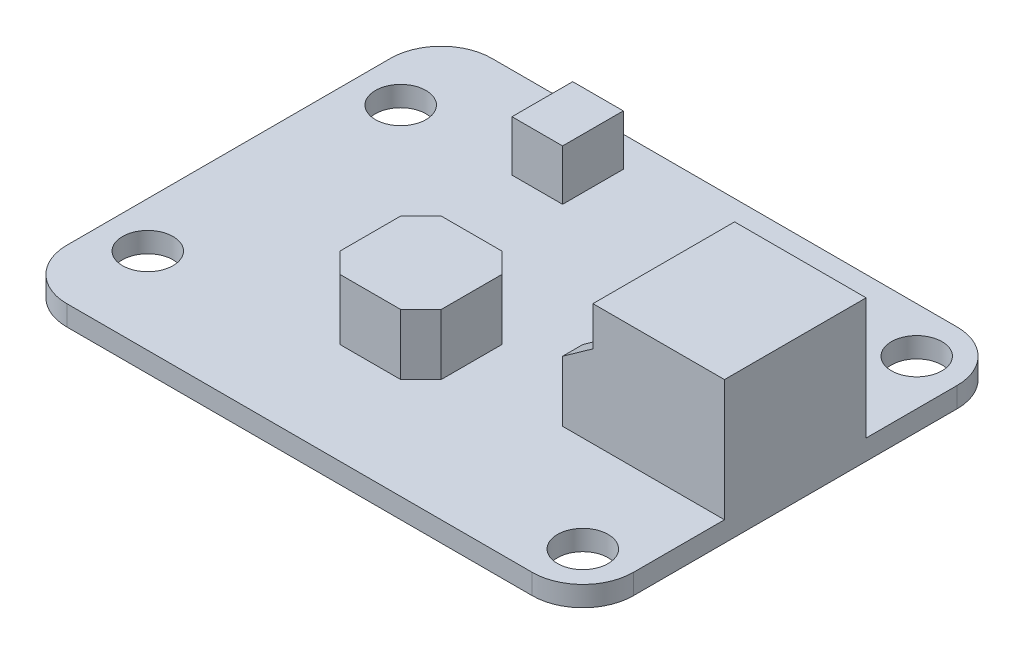
ISO-10303-21;
HEADER;
FILE_DESCRIPTION(('STEP AP214'),'2;1');
FILE_NAME('part.step','',(''),(''),'','','');
FILE_SCHEMA(('AUTOMOTIVE_DESIGN { 1 0 10303 214 1 1 1 1 }'));
ENDSEC;
DATA;
#1=APPLICATION_CONTEXT('core data for automotive mechanical design processes');
#2=APPLICATION_PROTOCOL_DEFINITION('international standard','automotive_design',2000,#1);
#3=PRODUCT_CONTEXT('',#1,'mechanical');
#4=PRODUCT('Part','Part','',(#3));
#5=PRODUCT_RELATED_PRODUCT_CATEGORY('part','',(#4));
#6=PRODUCT_DEFINITION_FORMATION('','',#4);
#7=PRODUCT_DEFINITION_CONTEXT('part definition',#1,'design');
#8=PRODUCT_DEFINITION('design','',#6,#7);
#9=PRODUCT_DEFINITION_SHAPE('','',#8);
#10=(LENGTH_UNIT() NAMED_UNIT(*) SI_UNIT(.MILLI.,.METRE.));
#11=(NAMED_UNIT(*) PLANE_ANGLE_UNIT() SI_UNIT($,.RADIAN.));
#12=(NAMED_UNIT(*) SI_UNIT($,.STERADIAN.) SOLID_ANGLE_UNIT());
#13=UNCERTAINTY_MEASURE_WITH_UNIT(LENGTH_MEASURE(1.E-05),#10,'distance_accuracy_value','');
#14=(GEOMETRIC_REPRESENTATION_CONTEXT(3) GLOBAL_UNCERTAINTY_ASSIGNED_CONTEXT((#13)) GLOBAL_UNIT_ASSIGNED_CONTEXT((#10,
#11,#12)) REPRESENTATION_CONTEXT('',''));
#15=CARTESIAN_POINT('',(0.,0.,0.));
#16=DIRECTION('',(0.,0.,1.));
#17=DIRECTION('',(1.,0.,0.));
#18=AXIS2_PLACEMENT_3D('',#15,#16,#17);
#19=CARTESIAN_POINT('',(11.5,1.,-8.));
#20=DIRECTION('',(0.,-1.,0.));
#21=DIRECTION('',(0.,0.,-1.));
#22=AXIS2_PLACEMENT_3D('',#19,#20,#21);
#23=PLANE('',#22);
#24=DIRECTION('',(-0.707106781186548,0.,0.707106781186548));
#25=VECTOR('',#24,1.);
#26=CARTESIAN_POINT('',(-4.,1.,1.5));
#27=LINE('',#26,#25);
#28=CARTESIAN_POINT('',(-3.,1.,0.5));
#29=VERTEX_POINT('',#28);
#30=CARTESIAN_POINT('',(-4.,1.,1.5));
#31=VERTEX_POINT('',#30);
#32=EDGE_CURVE('E250',#29,#31,#27,.T.);
#33=ORIENTED_EDGE('',*,*,#32,.F.);
#34=DIRECTION('',(-1.,0.,0.));
#35=VECTOR('',#34,1.);
#36=CARTESIAN_POINT('',(-3.,1.,0.5));
#37=LINE('',#36,#35);
#38=CARTESIAN_POINT('',(0.,1.,0.5));
#39=VERTEX_POINT('',#38);
#40=EDGE_CURVE('E263',#39,#29,#37,.T.);
#41=ORIENTED_EDGE('',*,*,#40,.F.);
#42=DIRECTION('',(-0.707106781186548,0.,-0.707106781186548));
#43=VECTOR('',#42,1.);
#44=CARTESIAN_POINT('',(1.,1.,1.5));
#45=LINE('',#44,#43);
#46=CARTESIAN_POINT('',(1.,1.,1.5));
#47=VERTEX_POINT('',#46);
#48=EDGE_CURVE('E292',#47,#39,#45,.T.);
#49=ORIENTED_EDGE('',*,*,#48,.F.);
#50=DIRECTION('',(0.,0.,-1.));
#51=VECTOR('',#50,1.);
#52=CARTESIAN_POINT('',(1.,1.,4.5));
#53=LINE('',#52,#51);
#54=CARTESIAN_POINT('',(1.,1.,4.5));
#55=VERTEX_POINT('',#54);
#56=EDGE_CURVE('E289',#55,#47,#53,.T.);
#57=ORIENTED_EDGE('',*,*,#56,.F.);
#58=DIRECTION('',(0.707106781186548,0.,-0.707106781186548));
#59=VECTOR('',#58,1.);
#60=CARTESIAN_POINT('',(0.,1.,5.5));
#61=LINE('',#60,#59);
#62=CARTESIAN_POINT('',(0.,1.,5.5));
#63=VERTEX_POINT('',#62);
#64=EDGE_CURVE('E286',#63,#55,#61,.T.);
#65=ORIENTED_EDGE('',*,*,#64,.F.);
#66=DIRECTION('',(1.,0.,0.));
#67=VECTOR('',#66,1.);
#68=CARTESIAN_POINT('',(-3.,1.,5.5));
#69=LINE('',#68,#67);
#70=CARTESIAN_POINT('',(-3.,1.,5.5));
#71=VERTEX_POINT('',#70);
#72=EDGE_CURVE('E283',#71,#63,#69,.T.);
#73=ORIENTED_EDGE('',*,*,#72,.F.);
#74=DIRECTION('',(0.707106781186548,0.,0.707106781186548));
#75=VECTOR('',#74,1.);
#76=CARTESIAN_POINT('',(-4.,1.,4.5));
#77=LINE('',#76,#75);
#78=CARTESIAN_POINT('',(-4.,1.,4.5));
#79=VERTEX_POINT('',#78);
#80=EDGE_CURVE('E280',#79,#71,#77,.T.);
#81=ORIENTED_EDGE('',*,*,#80,.F.);
#82=DIRECTION('',(0.,0.,1.));
#83=VECTOR('',#82,1.);
#84=CARTESIAN_POINT('',(-4.,1.,4.5));
#85=LINE('',#84,#83);
#86=EDGE_CURVE('E253',#31,#79,#85,.T.);
#87=ORIENTED_EDGE('',*,*,#86,.F.);
#88=EDGE_LOOP('',(#33,#41,#49,#57,#65,#73,#81,#87));
#89=FACE_BOUND('',#88,.T.);
#90=CARTESIAN_POINT('',(-11.75,1.,6.25));
#91=DIRECTION('',(0.,1.,0.));
#92=DIRECTION('',(0.,0.,1.));
#93=AXIS2_PLACEMENT_3D('',#90,#91,#92);
#94=CIRCLE('',#93,1.25);
#95=CARTESIAN_POINT('',(-11.75,1.,7.5));
#96=VERTEX_POINT('',#95);
#97=EDGE_CURVE('E390',#96,#96,#94,.T.);
#98=ORIENTED_EDGE('',*,*,#97,.F.);
#99=EDGE_LOOP('',(#98));
#100=FACE_BOUND('',#99,.T.);
#101=CARTESIAN_POINT('',(-11.75,1.,-6.25));
#102=DIRECTION('',(0.,1.,0.));
#103=DIRECTION('',(0.,0.,1.));
#104=AXIS2_PLACEMENT_3D('',#101,#102,#103);
#105=CIRCLE('',#104,1.25);
#106=CARTESIAN_POINT('',(-11.75,1.,-5.));
#107=VERTEX_POINT('',#106);
#108=EDGE_CURVE('E396',#107,#107,#105,.T.);
#109=ORIENTED_EDGE('',*,*,#108,.F.);
#110=EDGE_LOOP('',(#109));
#111=FACE_BOUND('',#110,.T.);
#112=CARTESIAN_POINT('',(11.75,1.,-8.25));
#113=DIRECTION('',(0.,1.,0.));
#114=DIRECTION('',(0.,0.,1.));
#115=AXIS2_PLACEMENT_3D('',#112,#113,#114);
#116=CIRCLE('',#115,1.25);
#117=CARTESIAN_POINT('',(11.75,1.,-7.));
#118=VERTEX_POINT('',#117);
#119=EDGE_CURVE('E402',#118,#118,#116,.T.);
#120=ORIENTED_EDGE('',*,*,#119,.F.);
#121=EDGE_LOOP('',(#120));
#122=FACE_BOUND('',#121,.T.);
#123=CARTESIAN_POINT('',(11.75,1.,8.25));
#124=DIRECTION('',(0.,1.,0.));
#125=DIRECTION('',(0.,0.,1.));
#126=AXIS2_PLACEMENT_3D('',#123,#124,#125);
#127=CIRCLE('',#126,1.25);
#128=CARTESIAN_POINT('',(11.75,1.,9.5));
#129=VERTEX_POINT('',#128);
#130=EDGE_CURVE('E408',#129,#129,#127,.T.);
#131=ORIENTED_EDGE('',*,*,#130,.F.);
#132=EDGE_LOOP('',(#131));
#133=FACE_BOUND('',#132,.T.);
#134=DIRECTION('',(-1.,0.,0.));
#135=VECTOR('',#134,1.);
#136=CARTESIAN_POINT('',(14.,1.,-3.5));
#137=LINE('',#136,#135);
#138=CARTESIAN_POINT('',(14.,1.,-3.5));
#139=VERTEX_POINT('',#138);
#140=CARTESIAN_POINT('',(6.,1.,-3.5));
#141=VERTEX_POINT('',#140);
#142=EDGE_CURVE('E345',#139,#141,#137,.T.);
#143=ORIENTED_EDGE('',*,*,#142,.F.);
#144=DIRECTION('',(0.,0.,-1.));
#145=VECTOR('',#144,1.);
#146=CARTESIAN_POINT('',(14.,1.,8.));
#147=LINE('',#146,#145);
#148=CARTESIAN_POINT('',(14.,1.,-8.));
#149=VERTEX_POINT('',#148);
#150=EDGE_CURVE('E430',#139,#149,#147,.T.);
#151=ORIENTED_EDGE('',*,*,#150,.T.);
#152=CARTESIAN_POINT('',(11.5,1.,-8.));
#153=DIRECTION('',(0.,1.,0.));
#154=DIRECTION('',(0.,0.,-1.));
#155=AXIS2_PLACEMENT_3D('',#152,#153,#154);
#156=CIRCLE('',#155,2.5);
#157=CARTESIAN_POINT('',(11.5,1.,-10.5));
#158=VERTEX_POINT('',#157);
#159=EDGE_CURVE('E414',#149,#158,#156,.T.);
#160=ORIENTED_EDGE('',*,*,#159,.T.);
#161=DIRECTION('',(-1.,0.,0.));
#162=VECTOR('',#161,1.);
#163=CARTESIAN_POINT('',(-11.5,1.,-10.5));
#164=LINE('',#163,#162);
#165=CARTESIAN_POINT('',(-11.5,1.,-10.5));
#166=VERTEX_POINT('',#165);
#167=EDGE_CURVE('E417',#158,#166,#164,.T.);
#168=ORIENTED_EDGE('',*,*,#167,.T.);
#169=CARTESIAN_POINT('',(-11.5,1.,-8.));
#170=DIRECTION('',(0.,1.,0.));
#171=DIRECTION('',(0.,0.,-1.));
#172=AXIS2_PLACEMENT_3D('',#169,#170,#171);
#173=CIRCLE('',#172,2.5);
#174=CARTESIAN_POINT('',(-14.,1.,-8.));
#175=VERTEX_POINT('',#174);
#176=EDGE_CURVE('E420',#166,#175,#173,.T.);
#177=ORIENTED_EDGE('',*,*,#176,.T.);
#178=DIRECTION('',(0.,0.,1.));
#179=VECTOR('',#178,1.);
#180=CARTESIAN_POINT('',(-14.,1.,8.));
#181=LINE('',#180,#179);
#182=CARTESIAN_POINT('',(-14.,1.,8.));
#183=VERTEX_POINT('',#182);
#184=EDGE_CURVE('E422',#175,#183,#181,.T.);
#185=ORIENTED_EDGE('',*,*,#184,.T.);
#186=CARTESIAN_POINT('',(-11.5,1.,8.));
#187=DIRECTION('',(0.,1.,0.));
#188=DIRECTION('',(0.,0.,-1.));
#189=AXIS2_PLACEMENT_3D('',#186,#187,#188);
#190=CIRCLE('',#189,2.5);
#191=CARTESIAN_POINT('',(-11.5,1.,10.5));
#192=VERTEX_POINT('',#191);
#193=EDGE_CURVE('E424',#183,#192,#190,.T.);
#194=ORIENTED_EDGE('',*,*,#193,.T.);
#195=DIRECTION('',(1.,0.,0.));
#196=VECTOR('',#195,1.);
#197=CARTESIAN_POINT('',(-11.5,1.,10.5));
#198=LINE('',#197,#196);
#199=CARTESIAN_POINT('',(11.5,1.,10.5));
#200=VERTEX_POINT('',#199);
#201=EDGE_CURVE('E426',#192,#200,#198,.T.);
#202=ORIENTED_EDGE('',*,*,#201,.T.);
#203=CARTESIAN_POINT('',(11.5,1.,8.));
#204=DIRECTION('',(0.,1.,0.));
#205=DIRECTION('',(0.,0.,1.));
#206=AXIS2_PLACEMENT_3D('',#203,#204,#205);
#207=CIRCLE('',#206,2.5);
#208=CARTESIAN_POINT('',(14.,1.,8.));
#209=VERTEX_POINT('',#208);
#210=EDGE_CURVE('E428',#200,#209,#207,.T.);
#211=ORIENTED_EDGE('',*,*,#210,.T.);
#212=CARTESIAN_POINT('',(14.,1.,3.5));
#213=VERTEX_POINT('',#212);
#214=EDGE_CURVE('E431',#209,#213,#147,.T.);
#215=ORIENTED_EDGE('',*,*,#214,.T.);
#216=DIRECTION('',(1.,0.,0.));
#217=VECTOR('',#216,1.);
#218=CARTESIAN_POINT('',(14.,1.,3.5));
#219=LINE('',#218,#217);
#220=CARTESIAN_POINT('',(6.,1.,3.5));
#221=VERTEX_POINT('',#220);
#222=EDGE_CURVE('E367',#221,#213,#219,.T.);
#223=ORIENTED_EDGE('',*,*,#222,.F.);
#224=DIRECTION('',(0.,0.,1.));
#225=VECTOR('',#224,1.);
#226=CARTESIAN_POINT('',(6.,1.,3.5));
#227=LINE('',#226,#225);
#228=CARTESIAN_POINT('',(6.,1.,2.5));
#229=VERTEX_POINT('',#228);
#230=EDGE_CURVE('E364',#229,#221,#227,.T.);
#231=ORIENTED_EDGE('',*,*,#230,.F.);
#232=DIRECTION('',(-1.,0.,0.));
#233=VECTOR('',#232,1.);
#234=CARTESIAN_POINT('',(7.5,1.,2.5));
#235=LINE('',#234,#233);
#236=CARTESIAN_POINT('',(7.5,1.,2.5));
#237=VERTEX_POINT('',#236);
#238=EDGE_CURVE('E361',#237,#229,#235,.T.);
#239=ORIENTED_EDGE('',*,*,#238,.F.);
#240=DIRECTION('',(0.,0.,1.));
#241=VECTOR('',#240,1.);
#242=CARTESIAN_POINT('',(7.5,1.,-2.5));
#243=LINE('',#242,#241);
#244=CARTESIAN_POINT('',(7.5,1.,-2.5));
#245=VERTEX_POINT('',#244);
#246=EDGE_CURVE('E358',#245,#237,#243,.T.);
#247=ORIENTED_EDGE('',*,*,#246,.F.);
#248=DIRECTION('',(1.,0.,0.));
#249=VECTOR('',#248,1.);
#250=CARTESIAN_POINT('',(6.,1.,-2.5));
#251=LINE('',#250,#249);
#252=CARTESIAN_POINT('',(6.,1.,-2.5));
#253=VERTEX_POINT('',#252);
#254=EDGE_CURVE('E355',#253,#245,#251,.T.);
#255=ORIENTED_EDGE('',*,*,#254,.F.);
#256=DIRECTION('',(0.,0.,1.));
#257=VECTOR('',#256,1.);
#258=CARTESIAN_POINT('',(6.,1.,-2.5));
#259=LINE('',#258,#257);
#260=EDGE_CURVE('E341',#141,#253,#259,.T.);
#261=ORIENTED_EDGE('',*,*,#260,.F.);
#262=EDGE_LOOP('',(#143,#151,#160,#168,#177,#185,#194,#202,#211,#215,#223,#231,#239,#247,#255,#261));
#263=FACE_BOUND('',#262,.T.);
#264=DIRECTION('',(0.,0.,-1.));
#265=VECTOR('',#264,1.);
#266=CARTESIAN_POINT('',(-3.5,1.,-9.));
#267=LINE('',#266,#265);
#268=CARTESIAN_POINT('',(-3.5,1.,-6.));
#269=VERTEX_POINT('',#268);
#270=CARTESIAN_POINT('',(-3.5,1.,-9.));
#271=VERTEX_POINT('',#270);
#272=EDGE_CURVE('E249',#269,#271,#267,.T.);
#273=ORIENTED_EDGE('',*,*,#272,.F.);
#274=DIRECTION('',(1.,0.,0.));
#275=VECTOR('',#274,1.);
#276=CARTESIAN_POINT('',(-6.,1.,-6.));
#277=LINE('',#276,#275);
#278=CARTESIAN_POINT('',(-6.,1.,-6.));
#279=VERTEX_POINT('',#278);
#280=EDGE_CURVE('E246',#279,#269,#277,.T.);
#281=ORIENTED_EDGE('',*,*,#280,.F.);
#282=DIRECTION('',(0.,0.,1.));
#283=VECTOR('',#282,1.);
#284=CARTESIAN_POINT('',(-6.,1.,-9.));
#285=LINE('',#284,#283);
#286=CARTESIAN_POINT('',(-6.,1.,-9.));
#287=VERTEX_POINT('',#286);
#288=EDGE_CURVE('E52',#287,#279,#285,.T.);
#289=ORIENTED_EDGE('',*,*,#288,.F.);
#290=DIRECTION('',(-1.,0.,0.));
#291=VECTOR('',#290,1.);
#292=CARTESIAN_POINT('',(-6.,1.,-9.));
#293=LINE('',#292,#291);
#294=EDGE_CURVE('E47',#271,#287,#293,.T.);
#295=ORIENTED_EDGE('',*,*,#294,.F.);
#296=EDGE_LOOP('',(#273,#281,#289,#295));
#297=FACE_BOUND('',#296,.T.);
#298=ADVANCED_FACE('F32',(#89,#100,#111,#122,#133,#263,#297),#23,.F.);
#299=CARTESIAN_POINT('',(11.5,0.,-8.));
#300=DIRECTION('',(0.,-1.,0.));
#301=DIRECTION('',(0.,0.,-1.));
#302=AXIS2_PLACEMENT_3D('',#299,#300,#301);
#303=PLANE('',#302);
#304=CARTESIAN_POINT('',(-11.75,0.,-6.25));
#305=DIRECTION('',(0.,1.,0.));
#306=DIRECTION('',(0.,0.,1.));
#307=AXIS2_PLACEMENT_3D('',#304,#305,#306);
#308=CIRCLE('',#307,1.25);
#309=CARTESIAN_POINT('',(-11.75,0.,-5.));
#310=VERTEX_POINT('',#309);
#311=EDGE_CURVE('E393',#310,#310,#308,.T.);
#312=ORIENTED_EDGE('',*,*,#311,.T.);
#313=EDGE_LOOP('',(#312));
#314=FACE_BOUND('',#313,.T.);
#315=CARTESIAN_POINT('',(11.75,0.,8.25));
#316=DIRECTION('',(0.,1.,0.));
#317=DIRECTION('',(0.,0.,1.));
#318=AXIS2_PLACEMENT_3D('',#315,#316,#317);
#319=CIRCLE('',#318,1.25);
#320=CARTESIAN_POINT('',(11.75,0.,9.5));
#321=VERTEX_POINT('',#320);
#322=EDGE_CURVE('E405',#321,#321,#319,.T.);
#323=ORIENTED_EDGE('',*,*,#322,.T.);
#324=EDGE_LOOP('',(#323));
#325=FACE_BOUND('',#324,.T.);
#326=CARTESIAN_POINT('',(11.5,0.,-8.));
#327=DIRECTION('',(0.,1.,0.));
#328=DIRECTION('',(0.,0.,-1.));
#329=AXIS2_PLACEMENT_3D('',#326,#327,#328);
#330=CIRCLE('',#329,2.5);
#331=CARTESIAN_POINT('',(14.,0.,-8.));
#332=VERTEX_POINT('',#331);
#333=CARTESIAN_POINT('',(11.5,0.,-10.5));
#334=VERTEX_POINT('',#333);
#335=EDGE_CURVE('E411',#332,#334,#330,.T.);
#336=ORIENTED_EDGE('',*,*,#335,.F.);
#337=DIRECTION('',(0.,0.,-1.));
#338=VECTOR('',#337,1.);
#339=CARTESIAN_POINT('',(14.,0.,8.));
#340=LINE('',#339,#338);
#341=CARTESIAN_POINT('',(14.,0.,8.));
#342=VERTEX_POINT('',#341);
#343=EDGE_CURVE('E418',#342,#332,#340,.T.);
#344=ORIENTED_EDGE('',*,*,#343,.F.);
#345=CARTESIAN_POINT('',(11.5,0.,8.));
#346=DIRECTION('',(0.,1.,0.));
#347=DIRECTION('',(0.,0.,1.));
#348=AXIS2_PLACEMENT_3D('',#345,#346,#347);
#349=CIRCLE('',#348,2.5);
#350=CARTESIAN_POINT('',(11.5,0.,10.5));
#351=VERTEX_POINT('',#350);
#352=EDGE_CURVE('E446',#351,#342,#349,.T.);
#353=ORIENTED_EDGE('',*,*,#352,.F.);
#354=DIRECTION('',(1.,0.,0.));
#355=VECTOR('',#354,1.);
#356=CARTESIAN_POINT('',(-11.5,0.,10.5));
#357=LINE('',#356,#355);
#358=CARTESIAN_POINT('',(-11.5,0.,10.5));
#359=VERTEX_POINT('',#358);
#360=EDGE_CURVE('E444',#359,#351,#357,.T.);
#361=ORIENTED_EDGE('',*,*,#360,.F.);
#362=CARTESIAN_POINT('',(-11.5,0.,8.));
#363=DIRECTION('',(0.,1.,0.));
#364=DIRECTION('',(0.,0.,-1.));
#365=AXIS2_PLACEMENT_3D('',#362,#363,#364);
#366=CIRCLE('',#365,2.5);
#367=CARTESIAN_POINT('',(-14.,0.,8.));
#368=VERTEX_POINT('',#367);
#369=EDGE_CURVE('E442',#368,#359,#366,.T.);
#370=ORIENTED_EDGE('',*,*,#369,.F.);
#371=DIRECTION('',(0.,0.,1.));
#372=VECTOR('',#371,1.);
#373=CARTESIAN_POINT('',(-14.,0.,8.));
#374=LINE('',#373,#372);
#375=CARTESIAN_POINT('',(-14.,0.,-8.));
#376=VERTEX_POINT('',#375);
#377=EDGE_CURVE('E440',#376,#368,#374,.T.);
#378=ORIENTED_EDGE('',*,*,#377,.F.);
#379=CARTESIAN_POINT('',(-11.5,0.,-8.));
#380=DIRECTION('',(0.,1.,0.));
#381=DIRECTION('',(0.,0.,-1.));
#382=AXIS2_PLACEMENT_3D('',#379,#380,#381);
#383=CIRCLE('',#382,2.5);
#384=CARTESIAN_POINT('',(-11.5,0.,-10.5));
#385=VERTEX_POINT('',#384);
#386=EDGE_CURVE('E438',#385,#376,#383,.T.);
#387=ORIENTED_EDGE('',*,*,#386,.F.);
#388=DIRECTION('',(-1.,0.,0.));
#389=VECTOR('',#388,1.);
#390=CARTESIAN_POINT('',(-11.5,0.,-10.5));
#391=LINE('',#390,#389);
#392=EDGE_CURVE('E436',#334,#385,#391,.T.);
#393=ORIENTED_EDGE('',*,*,#392,.F.);
#394=EDGE_LOOP('',(#336,#344,#353,#361,#370,#378,#387,#393));
#395=FACE_BOUND('',#394,.T.);
#396=CARTESIAN_POINT('',(11.75,0.,-8.25));
#397=DIRECTION('',(0.,1.,0.));
#398=DIRECTION('',(0.,0.,1.));
#399=AXIS2_PLACEMENT_3D('',#396,#397,#398);
#400=CIRCLE('',#399,1.25);
#401=CARTESIAN_POINT('',(11.75,0.,-7.));
#402=VERTEX_POINT('',#401);
#403=EDGE_CURVE('E399',#402,#402,#400,.T.);
#404=ORIENTED_EDGE('',*,*,#403,.T.);
#405=EDGE_LOOP('',(#404));
#406=FACE_BOUND('',#405,.T.);
#407=CARTESIAN_POINT('',(-11.75,0.,6.25));
#408=DIRECTION('',(0.,1.,0.));
#409=DIRECTION('',(0.,0.,1.));
#410=AXIS2_PLACEMENT_3D('',#407,#408,#409);
#411=CIRCLE('',#410,1.25);
#412=CARTESIAN_POINT('',(-11.75,0.,7.5));
#413=VERTEX_POINT('',#412);
#414=EDGE_CURVE('E389',#413,#413,#411,.T.);
#415=ORIENTED_EDGE('',*,*,#414,.T.);
#416=EDGE_LOOP('',(#415));
#417=FACE_BOUND('',#416,.T.);
#418=ADVANCED_FACE('F479',(#314,#325,#395,#406,#417),#303,.T.);
#419=CARTESIAN_POINT('',(11.5,1.,-8.));
#420=DIRECTION('',(0.,-1.,0.));
#421=DIRECTION('',(0.,0.,-1.));
#422=AXIS2_PLACEMENT_3D('',#419,#420,#421);
#423=CYLINDRICAL_SURFACE('',#422,2.5);
#424=ORIENTED_EDGE('',*,*,#335,.T.);
#425=DIRECTION('',(0.,-1.,0.));
#426=VECTOR('',#425,1.);
#427=CARTESIAN_POINT('',(11.5,1.,-10.5));
#428=LINE('',#427,#426);
#429=EDGE_CURVE('E40',#158,#334,#428,.T.);
#430=ORIENTED_EDGE('',*,*,#429,.F.);
#431=ORIENTED_EDGE('',*,*,#159,.F.);
#432=DIRECTION('',(0.,-1.,0.));
#433=VECTOR('',#432,1.);
#434=CARTESIAN_POINT('',(14.,1.,-8.));
#435=LINE('',#434,#433);
#436=EDGE_CURVE('E433',#149,#332,#435,.T.);
#437=ORIENTED_EDGE('',*,*,#436,.T.);
#438=EDGE_LOOP('',(#424,#430,#431,#437));
#439=FACE_BOUND('',#438,.T.);
#440=ADVANCED_FACE('F34',(#439),#423,.T.);
#441=CARTESIAN_POINT('',(-11.5,1.,-10.5));
#442=DIRECTION('',(0.,0.,1.));
#443=DIRECTION('',(1.,0.,0.));
#444=AXIS2_PLACEMENT_3D('',#441,#442,#443);
#445=PLANE('',#444);
#446=ORIENTED_EDGE('',*,*,#392,.T.);
#447=DIRECTION('',(0.,-1.,0.));
#448=VECTOR('',#447,1.);
#449=CARTESIAN_POINT('',(-11.5,1.,-10.5));
#450=LINE('',#449,#448);
#451=EDGE_CURVE('E466',#166,#385,#450,.T.);
#452=ORIENTED_EDGE('',*,*,#451,.F.);
#453=ORIENTED_EDGE('',*,*,#167,.F.);
#454=ORIENTED_EDGE('',*,*,#429,.T.);
#455=EDGE_LOOP('',(#446,#452,#453,#454));
#456=FACE_BOUND('',#455,.T.);
#457=ADVANCED_FACE('F471',(#456),#445,.F.);
#458=CARTESIAN_POINT('',(-11.5,1.,-8.));
#459=DIRECTION('',(0.,-1.,0.));
#460=DIRECTION('',(0.,0.,-1.));
#461=AXIS2_PLACEMENT_3D('',#458,#459,#460);
#462=CYLINDRICAL_SURFACE('',#461,2.5);
#463=ORIENTED_EDGE('',*,*,#386,.T.);
#464=DIRECTION('',(0.,-1.,0.));
#465=VECTOR('',#464,1.);
#466=CARTESIAN_POINT('',(-14.,1.,-8.));
#467=LINE('',#466,#465);
#468=EDGE_CURVE('E463',#175,#376,#467,.T.);
#469=ORIENTED_EDGE('',*,*,#468,.F.);
#470=ORIENTED_EDGE('',*,*,#176,.F.);
#471=ORIENTED_EDGE('',*,*,#451,.T.);
#472=EDGE_LOOP('',(#463,#469,#470,#471));
#473=FACE_BOUND('',#472,.T.);
#474=ADVANCED_FACE('F487',(#473),#462,.T.);
#475=CARTESIAN_POINT('',(-14.,1.,8.));
#476=DIRECTION('',(1.,0.,0.));
#477=DIRECTION('',(0.,0.,-1.));
#478=AXIS2_PLACEMENT_3D('',#475,#476,#477);
#479=PLANE('',#478);
#480=ORIENTED_EDGE('',*,*,#377,.T.);
#481=DIRECTION('',(0.,-1.,0.));
#482=VECTOR('',#481,1.);
#483=CARTESIAN_POINT('',(-14.,1.,8.));
#484=LINE('',#483,#482);
#485=EDGE_CURVE('E460',#183,#368,#484,.T.);
#486=ORIENTED_EDGE('',*,*,#485,.F.);
#487=ORIENTED_EDGE('',*,*,#184,.F.);
#488=ORIENTED_EDGE('',*,*,#468,.T.);
#489=EDGE_LOOP('',(#480,#486,#487,#488));
#490=FACE_BOUND('',#489,.T.);
#491=ADVANCED_FACE('F491',(#490),#479,.F.);
#492=CARTESIAN_POINT('',(-11.5,1.,8.));
#493=DIRECTION('',(0.,-1.,0.));
#494=DIRECTION('',(0.,0.,-1.));
#495=AXIS2_PLACEMENT_3D('',#492,#493,#494);
#496=CYLINDRICAL_SURFACE('',#495,2.5);
#497=ORIENTED_EDGE('',*,*,#369,.T.);
#498=DIRECTION('',(0.,-1.,0.));
#499=VECTOR('',#498,1.);
#500=CARTESIAN_POINT('',(-11.5,1.,10.5));
#501=LINE('',#500,#499);
#502=EDGE_CURVE('E457',#192,#359,#501,.T.);
#503=ORIENTED_EDGE('',*,*,#502,.F.);
#504=ORIENTED_EDGE('',*,*,#193,.F.);
#505=ORIENTED_EDGE('',*,*,#485,.T.);
#506=EDGE_LOOP('',(#497,#503,#504,#505));
#507=FACE_BOUND('',#506,.T.);
#508=ADVANCED_FACE('F512',(#507),#496,.T.);
#509=CARTESIAN_POINT('',(-11.5,1.,10.5));
#510=DIRECTION('',(0.,0.,-1.));
#511=DIRECTION('',(-1.,0.,0.));
#512=AXIS2_PLACEMENT_3D('',#509,#510,#511);
#513=PLANE('',#512);
#514=ORIENTED_EDGE('',*,*,#360,.T.);
#515=DIRECTION('',(0.,-1.,0.));
#516=VECTOR('',#515,1.);
#517=CARTESIAN_POINT('',(11.5,1.,10.5));
#518=LINE('',#517,#516);
#519=EDGE_CURVE('E454',#200,#351,#518,.T.);
#520=ORIENTED_EDGE('',*,*,#519,.F.);
#521=ORIENTED_EDGE('',*,*,#201,.F.);
#522=ORIENTED_EDGE('',*,*,#502,.T.);
#523=EDGE_LOOP('',(#514,#520,#521,#522));
#524=FACE_BOUND('',#523,.T.);
#525=ADVANCED_FACE('F509',(#524),#513,.F.);
#526=CARTESIAN_POINT('',(11.5,1.,8.));
#527=DIRECTION('',(0.,-1.,0.));
#528=DIRECTION('',(0.,0.,-1.));
#529=AXIS2_PLACEMENT_3D('',#526,#527,#528);
#530=CYLINDRICAL_SURFACE('',#529,2.5);
#531=ORIENTED_EDGE('',*,*,#352,.T.);
#532=DIRECTION('',(0.,-1.,0.));
#533=VECTOR('',#532,1.);
#534=CARTESIAN_POINT('',(14.,1.,8.));
#535=LINE('',#534,#533);
#536=EDGE_CURVE('E451',#209,#342,#535,.T.);
#537=ORIENTED_EDGE('',*,*,#536,.F.);
#538=ORIENTED_EDGE('',*,*,#210,.F.);
#539=ORIENTED_EDGE('',*,*,#519,.T.);
#540=EDGE_LOOP('',(#531,#537,#538,#539));
#541=FACE_BOUND('',#540,.T.);
#542=ADVANCED_FACE('F505',(#541),#530,.T.);
#543=CARTESIAN_POINT('',(14.,1.,8.));
#544=DIRECTION('',(-1.,0.,0.));
#545=DIRECTION('',(0.,0.,1.));
#546=AXIS2_PLACEMENT_3D('',#543,#544,#545);
#547=PLANE('',#546);
#548=ORIENTED_EDGE('',*,*,#343,.T.);
#549=ORIENTED_EDGE('',*,*,#436,.F.);
#550=ORIENTED_EDGE('',*,*,#150,.F.);
#551=DIRECTION('',(0.,-1.,0.));
#552=VECTOR('',#551,1.);
#553=CARTESIAN_POINT('',(14.,7.,-3.5));
#554=LINE('',#553,#552);
#555=CARTESIAN_POINT('',(14.,7.,-3.5));
#556=VERTEX_POINT('',#555);
#557=EDGE_CURVE('E373',#556,#139,#554,.T.);
#558=ORIENTED_EDGE('',*,*,#557,.F.);
#559=DIRECTION('',(0.,0.,-1.));
#560=VECTOR('',#559,1.);
#561=CARTESIAN_POINT('',(14.,7.,3.5));
#562=LINE('',#561,#560);
#563=CARTESIAN_POINT('',(14.,7.,3.5));
#564=VERTEX_POINT('',#563);
#565=EDGE_CURVE('E347',#564,#556,#562,.T.);
#566=ORIENTED_EDGE('',*,*,#565,.F.);
#567=DIRECTION('',(0.,-1.,0.));
#568=VECTOR('',#567,1.);
#569=CARTESIAN_POINT('',(14.,7.,3.5));
#570=LINE('',#569,#568);
#571=EDGE_CURVE('E376',#564,#213,#570,.T.);
#572=ORIENTED_EDGE('',*,*,#571,.T.);
#573=ORIENTED_EDGE('',*,*,#214,.F.);
#574=ORIENTED_EDGE('',*,*,#536,.T.);
#575=EDGE_LOOP('',(#548,#549,#550,#558,#566,#572,#573,#574));
#576=FACE_BOUND('',#575,.T.);
#577=ADVANCED_FACE('F500',(#576),#547,.F.);
#578=CARTESIAN_POINT('',(11.75,1.,8.25));
#579=DIRECTION('',(0.,-1.,0.));
#580=DIRECTION('',(0.,0.,-1.));
#581=AXIS2_PLACEMENT_3D('',#578,#579,#580);
#582=CYLINDRICAL_SURFACE('',#581,1.25);
#583=ORIENTED_EDGE('',*,*,#130,.T.);
#584=EDGE_LOOP('',(#583));
#585=FACE_BOUND('',#584,.T.);
#586=ORIENTED_EDGE('',*,*,#322,.F.);
#587=EDGE_LOOP('',(#586));
#588=FACE_BOUND('',#587,.T.);
#589=ADVANCED_FACE('F531',(#585,#588),#582,.F.);
#590=CARTESIAN_POINT('',(11.75,1.,-8.25));
#591=DIRECTION('',(0.,-1.,0.));
#592=DIRECTION('',(0.,0.,-1.));
#593=AXIS2_PLACEMENT_3D('',#590,#591,#592);
#594=CYLINDRICAL_SURFACE('',#593,1.25);
#595=ORIENTED_EDGE('',*,*,#119,.T.);
#596=EDGE_LOOP('',(#595));
#597=FACE_BOUND('',#596,.T.);
#598=ORIENTED_EDGE('',*,*,#403,.F.);
#599=EDGE_LOOP('',(#598));
#600=FACE_BOUND('',#599,.T.);
#601=ADVANCED_FACE('F553',(#597,#600),#594,.F.);
#602=CARTESIAN_POINT('',(-11.75,1.,-6.25));
#603=DIRECTION('',(0.,-1.,0.));
#604=DIRECTION('',(0.,0.,-1.));
#605=AXIS2_PLACEMENT_3D('',#602,#603,#604);
#606=CYLINDRICAL_SURFACE('',#605,1.25);
#607=ORIENTED_EDGE('',*,*,#108,.T.);
#608=EDGE_LOOP('',(#607));
#609=FACE_BOUND('',#608,.T.);
#610=ORIENTED_EDGE('',*,*,#311,.F.);
#611=EDGE_LOOP('',(#610));
#612=FACE_BOUND('',#611,.T.);
#613=ADVANCED_FACE('F560',(#609,#612),#606,.F.);
#614=CARTESIAN_POINT('',(-11.75,1.,6.25));
#615=DIRECTION('',(0.,-1.,0.));
#616=DIRECTION('',(0.,0.,-1.));
#617=AXIS2_PLACEMENT_3D('',#614,#615,#616);
#618=CYLINDRICAL_SURFACE('',#617,1.25);
#619=ORIENTED_EDGE('',*,*,#97,.T.);
#620=EDGE_LOOP('',(#619));
#621=FACE_BOUND('',#620,.T.);
#622=ORIENTED_EDGE('',*,*,#414,.F.);
#623=EDGE_LOOP('',(#622));
#624=FACE_BOUND('',#623,.T.);
#625=ADVANCED_FACE('F567',(#621,#624),#618,.F.);
#626=CARTESIAN_POINT('',(6.,7.,-2.5));
#627=DIRECTION('',(1.,0.,0.));
#628=DIRECTION('',(0.,0.,-1.));
#629=AXIS2_PLACEMENT_3D('',#626,#627,#628);
#630=PLANE('',#629);
#631=DIRECTION('',(0.,-1.,0.));
#632=VECTOR('',#631,1.);
#633=CARTESIAN_POINT('',(6.,7.,-2.5));
#634=LINE('',#633,#632);
#635=CARTESIAN_POINT('',(6.,4.,-2.5));
#636=VERTEX_POINT('',#635);
#637=EDGE_CURVE('E387',#636,#253,#634,.T.);
#638=ORIENTED_EDGE('',*,*,#637,.F.);
#639=DIRECTION('',(0.,0.,1.));
#640=VECTOR('',#639,1.);
#641=CARTESIAN_POINT('',(6.,4.,-10.5));
#642=LINE('',#641,#640);
#643=CARTESIAN_POINT('',(6.,4.,-3.5));
#644=VERTEX_POINT('',#643);
#645=EDGE_CURVE('E330',#644,#636,#642,.T.);
#646=ORIENTED_EDGE('',*,*,#645,.F.);
#647=DIRECTION('',(0.,-1.,0.));
#648=VECTOR('',#647,1.);
#649=CARTESIAN_POINT('',(6.,7.,-3.5));
#650=LINE('',#649,#648);
#651=EDGE_CURVE('E352',#644,#141,#650,.T.);
#652=ORIENTED_EDGE('',*,*,#651,.T.);
#653=ORIENTED_EDGE('',*,*,#260,.T.);
#654=EDGE_LOOP('',(#638,#646,#652,#653));
#655=FACE_BOUND('',#654,.T.);
#656=ADVANCED_FACE('F574',(#655),#630,.F.);
#657=CARTESIAN_POINT('',(6.,7.,-2.5));
#658=DIRECTION('',(0.,0.,-1.));
#659=DIRECTION('',(-1.,0.,0.));
#660=AXIS2_PLACEMENT_3D('',#657,#658,#659);
#661=PLANE('',#660);
#662=DIRECTION('',(0.,-1.,0.));
#663=VECTOR('',#662,1.);
#664=CARTESIAN_POINT('',(7.5,7.,-2.5));
#665=LINE('',#664,#663);
#666=CARTESIAN_POINT('',(7.5,5.06401717505367,-2.5));
#667=VERTEX_POINT('',#666);
#668=EDGE_CURVE('E385',#667,#245,#665,.T.);
#669=ORIENTED_EDGE('',*,*,#668,.F.);
#670=DIRECTION('',(-0.815635175400038,-0.57856655680237,0.));
#671=VECTOR('',#670,1.);
#672=CARTESIAN_POINT('',(7.41569770511429,5.00421778195045,-2.5));
#673=LINE('',#672,#671);
#674=EDGE_CURVE('E338',#667,#636,#673,.T.);
#675=ORIENTED_EDGE('',*,*,#674,.T.);
#676=ORIENTED_EDGE('',*,*,#637,.T.);
#677=ORIENTED_EDGE('',*,*,#254,.T.);
#678=EDGE_LOOP('',(#669,#675,#676,#677));
#679=FACE_BOUND('',#678,.T.);
#680=ADVANCED_FACE('F581',(#679),#661,.F.);
#681=CARTESIAN_POINT('',(7.5,7.,-2.5));
#682=DIRECTION('',(1.,0.,0.));
#683=DIRECTION('',(0.,0.,-1.));
#684=AXIS2_PLACEMENT_3D('',#681,#682,#683);
#685=PLANE('',#684);
#686=DIRECTION('',(0.,-1.,0.));
#687=VECTOR('',#686,1.);
#688=CARTESIAN_POINT('',(7.5,7.,2.5));
#689=LINE('',#688,#687);
#690=CARTESIAN_POINT('',(7.5,5.06401717505367,2.5));
#691=VERTEX_POINT('',#690);
#692=EDGE_CURVE('E383',#691,#237,#689,.T.);
#693=ORIENTED_EDGE('',*,*,#692,.F.);
#694=DIRECTION('',(0.,0.,1.));
#695=VECTOR('',#694,1.);
#696=CARTESIAN_POINT('',(7.5,5.06401717505367,-10.5));
#697=LINE('',#696,#695);
#698=CARTESIAN_POINT('',(7.5,5.06401717505367,3.5));
#699=VERTEX_POINT('',#698);
#700=EDGE_CURVE('E327',#691,#699,#697,.T.);
#701=ORIENTED_EDGE('',*,*,#700,.T.);
#702=DIRECTION('',(0.,1.,0.));
#703=VECTOR('',#702,1.);
#704=CARTESIAN_POINT('',(7.5,7.,3.5));
#705=LINE('',#704,#703);
#706=CARTESIAN_POINT('',(7.5,7.,3.5));
#707=VERTEX_POINT('',#706);
#708=EDGE_CURVE('E323',#699,#707,#705,.T.);
#709=ORIENTED_EDGE('',*,*,#708,.T.);
#710=DIRECTION('',(0.,0.,1.));
#711=VECTOR('',#710,1.);
#712=CARTESIAN_POINT('',(7.5,7.,-2.5));
#713=LINE('',#712,#711);
#714=CARTESIAN_POINT('',(7.5,7.,-3.5));
#715=VERTEX_POINT('',#714);
#716=EDGE_CURVE('E342',#715,#707,#713,.T.);
#717=ORIENTED_EDGE('',*,*,#716,.F.);
#718=DIRECTION('',(0.,1.,0.));
#719=VECTOR('',#718,1.);
#720=CARTESIAN_POINT('',(7.5,7.,-3.5));
#721=LINE('',#720,#719);
#722=CARTESIAN_POINT('',(7.5,5.06401717505367,-3.5));
#723=VERTEX_POINT('',#722);
#724=EDGE_CURVE('E332',#723,#715,#721,.T.);
#725=ORIENTED_EDGE('',*,*,#724,.F.);
#726=EDGE_CURVE('E329',#723,#667,#697,.T.);
#727=ORIENTED_EDGE('',*,*,#726,.T.);
#728=ORIENTED_EDGE('',*,*,#668,.T.);
#729=ORIENTED_EDGE('',*,*,#246,.T.);
#730=EDGE_LOOP('',(#693,#701,#709,#717,#725,#727,#728,#729));
#731=FACE_BOUND('',#730,.T.);
#732=ADVANCED_FACE('F589',(#731),#685,.F.);
#733=CARTESIAN_POINT('',(7.5,7.,2.5));
#734=DIRECTION('',(0.,0.,1.));
#735=DIRECTION('',(1.,0.,0.));
#736=AXIS2_PLACEMENT_3D('',#733,#734,#735);
#737=PLANE('',#736);
#738=DIRECTION('',(0.,-1.,0.));
#739=VECTOR('',#738,1.);
#740=CARTESIAN_POINT('',(6.,7.,2.5));
#741=LINE('',#740,#739);
#742=CARTESIAN_POINT('',(6.,4.,2.5));
#743=VERTEX_POINT('',#742);
#744=EDGE_CURVE('E381',#743,#229,#741,.T.);
#745=ORIENTED_EDGE('',*,*,#744,.F.);
#746=DIRECTION('',(0.815635175400038,0.57856655680237,0.));
#747=VECTOR('',#746,1.);
#748=CARTESIAN_POINT('',(8.41358881413907,5.71206663450759,2.5));
#749=LINE('',#748,#747);
#750=EDGE_CURVE('E335',#743,#691,#749,.T.);
#751=ORIENTED_EDGE('',*,*,#750,.T.);
#752=ORIENTED_EDGE('',*,*,#692,.T.);
#753=ORIENTED_EDGE('',*,*,#238,.T.);
#754=EDGE_LOOP('',(#745,#751,#752,#753));
#755=FACE_BOUND('',#754,.T.);
#756=ADVANCED_FACE('F597',(#755),#737,.F.);
#757=CARTESIAN_POINT('',(6.,7.,3.5));
#758=DIRECTION('',(1.,0.,0.));
#759=DIRECTION('',(0.,0.,-1.));
#760=AXIS2_PLACEMENT_3D('',#757,#758,#759);
#761=PLANE('',#760);
#762=DIRECTION('',(0.,-1.,0.));
#763=VECTOR('',#762,1.);
#764=CARTESIAN_POINT('',(6.,7.,3.5));
#765=LINE('',#764,#763);
#766=CARTESIAN_POINT('',(6.,4.,3.5));
#767=VERTEX_POINT('',#766);
#768=EDGE_CURVE('E379',#767,#221,#765,.T.);
#769=ORIENTED_EDGE('',*,*,#768,.F.);
#770=EDGE_CURVE('E326',#743,#767,#642,.T.);
#771=ORIENTED_EDGE('',*,*,#770,.F.);
#772=ORIENTED_EDGE('',*,*,#744,.T.);
#773=ORIENTED_EDGE('',*,*,#230,.T.);
#774=EDGE_LOOP('',(#769,#771,#772,#773));
#775=FACE_BOUND('',#774,.T.);
#776=ADVANCED_FACE('F605',(#775),#761,.F.);
#777=CARTESIAN_POINT('',(14.,7.,3.5));
#778=DIRECTION('',(0.,0.,-1.));
#779=DIRECTION('',(-1.,0.,0.));
#780=AXIS2_PLACEMENT_3D('',#777,#778,#779);
#781=PLANE('',#780);
#782=DIRECTION('',(1.,0.,0.));
#783=VECTOR('',#782,1.);
#784=CARTESIAN_POINT('',(14.,7.,3.5));
#785=LINE('',#784,#783);
#786=EDGE_CURVE('E344',#707,#564,#785,.T.);
#787=ORIENTED_EDGE('',*,*,#786,.F.);
#788=ORIENTED_EDGE('',*,*,#708,.F.);
#789=DIRECTION('',(0.815635175400037,0.57856655680237,0.));
#790=VECTOR('',#789,1.);
#791=CARTESIAN_POINT('',(7.5,5.06401717505367,3.5));
#792=LINE('',#791,#790);
#793=EDGE_CURVE('E320',#767,#699,#792,.T.);
#794=ORIENTED_EDGE('',*,*,#793,.F.);
#795=ORIENTED_EDGE('',*,*,#768,.T.);
#796=ORIENTED_EDGE('',*,*,#222,.T.);
#797=ORIENTED_EDGE('',*,*,#571,.F.);
#798=EDGE_LOOP('',(#787,#788,#794,#795,#796,#797));
#799=FACE_BOUND('',#798,.T.);
#800=ADVANCED_FACE('F613',(#799),#781,.F.);
#801=CARTESIAN_POINT('',(14.,7.,-3.5));
#802=DIRECTION('',(0.,0.,1.));
#803=DIRECTION('',(1.,0.,0.));
#804=AXIS2_PLACEMENT_3D('',#801,#802,#803);
#805=PLANE('',#804);
#806=DIRECTION('',(0.815635175400038,0.57856655680237,0.));
#807=VECTOR('',#806,1.);
#808=CARTESIAN_POINT('',(12.7377836199131,8.77941166225523,-3.5));
#809=LINE('',#808,#807);
#810=EDGE_CURVE('E11',#644,#723,#809,.T.);
#811=ORIENTED_EDGE('',*,*,#810,.T.);
#812=ORIENTED_EDGE('',*,*,#724,.T.);
#813=DIRECTION('',(-1.,0.,0.));
#814=VECTOR('',#813,1.);
#815=CARTESIAN_POINT('',(14.,7.,-3.5));
#816=LINE('',#815,#814);
#817=EDGE_CURVE('E349',#556,#715,#816,.T.);
#818=ORIENTED_EDGE('',*,*,#817,.F.);
#819=ORIENTED_EDGE('',*,*,#557,.T.);
#820=ORIENTED_EDGE('',*,*,#142,.T.);
#821=ORIENTED_EDGE('',*,*,#651,.F.);
#822=EDGE_LOOP('',(#811,#812,#818,#819,#820,#821));
#823=FACE_BOUND('',#822,.T.);
#824=ADVANCED_FACE('F621',(#823),#805,.F.);
#825=CARTESIAN_POINT('',(0.,7.,0.));
#826=DIRECTION('',(0.,1.,0.));
#827=DIRECTION('',(0.,0.,1.));
#828=AXIS2_PLACEMENT_3D('',#825,#826,#827);
#829=PLANE('',#828);
#830=ORIENTED_EDGE('',*,*,#716,.T.);
#831=ORIENTED_EDGE('',*,*,#786,.T.);
#832=ORIENTED_EDGE('',*,*,#565,.T.);
#833=ORIENTED_EDGE('',*,*,#817,.T.);
#834=EDGE_LOOP('',(#830,#831,#832,#833));
#835=FACE_BOUND('',#834,.T.);
#836=ADVANCED_FACE('F629',(#835),#829,.T.);
#837=CARTESIAN_POINT('',(7.5,5.06401717505367,-10.5));
#838=DIRECTION('',(0.57856655680237,-0.815635175400037,0.));
#839=DIRECTION('',(0.815635175400038,0.57856655680237,0.));
#840=AXIS2_PLACEMENT_3D('',#837,#838,#839);
#841=PLANE('',#840);
#842=ORIENTED_EDGE('',*,*,#726,.F.);
#843=ORIENTED_EDGE('',*,*,#810,.F.);
#844=ORIENTED_EDGE('',*,*,#645,.T.);
#845=ORIENTED_EDGE('',*,*,#674,.F.);
#846=EDGE_LOOP('',(#842,#843,#844,#845));
#847=FACE_BOUND('',#846,.T.);
#848=ADVANCED_FACE('F637',(#847),#841,.F.);
#849=ORIENTED_EDGE('',*,*,#770,.T.);
#850=ORIENTED_EDGE('',*,*,#793,.T.);
#851=ORIENTED_EDGE('',*,*,#700,.F.);
#852=ORIENTED_EDGE('',*,*,#750,.F.);
#853=EDGE_LOOP('',(#849,#850,#851,#852));
#854=FACE_BOUND('',#853,.T.);
#855=ADVANCED_FACE('F645',(#854),#841,.F.);
#856=CARTESIAN_POINT('',(-4.,4.,1.5));
#857=DIRECTION('',(0.707106781186547,0.,0.707106781186547));
#858=DIRECTION('',(0.707106781186548,0.,-0.707106781186548));
#859=AXIS2_PLACEMENT_3D('',#856,#857,#858);
#860=PLANE('',#859);
#861=ORIENTED_EDGE('',*,*,#32,.T.);
#862=DIRECTION('',(0.,-1.,0.));
#863=VECTOR('',#862,1.);
#864=CARTESIAN_POINT('',(-4.,4.,1.5));
#865=LINE('',#864,#863);
#866=CARTESIAN_POINT('',(-4.,4.,1.5));
#867=VERTEX_POINT('',#866);
#868=EDGE_CURVE('E317',#867,#31,#865,.T.);
#869=ORIENTED_EDGE('',*,*,#868,.F.);
#870=DIRECTION('',(-0.707106781186548,0.,0.707106781186548));
#871=VECTOR('',#870,1.);
#872=CARTESIAN_POINT('',(-4.,4.,1.5));
#873=LINE('',#872,#871);
#874=CARTESIAN_POINT('',(-3.,4.,0.5));
#875=VERTEX_POINT('',#874);
#876=EDGE_CURVE('E259',#875,#867,#873,.T.);
#877=ORIENTED_EDGE('',*,*,#876,.F.);
#878=DIRECTION('',(0.,-1.,0.));
#879=VECTOR('',#878,1.);
#880=CARTESIAN_POINT('',(-3.,4.,0.5));
#881=LINE('',#880,#879);
#882=EDGE_CURVE('E276',#875,#29,#881,.T.);
#883=ORIENTED_EDGE('',*,*,#882,.T.);
#884=EDGE_LOOP('',(#861,#869,#877,#883));
#885=FACE_BOUND('',#884,.T.);
#886=ADVANCED_FACE('F653',(#885),#860,.F.);
#887=CARTESIAN_POINT('',(-4.,4.,4.5));
#888=DIRECTION('',(1.,0.,0.));
#889=DIRECTION('',(0.,0.,-1.));
#890=AXIS2_PLACEMENT_3D('',#887,#888,#889);
#891=PLANE('',#890);
#892=ORIENTED_EDGE('',*,*,#86,.T.);
#893=DIRECTION('',(0.,-1.,0.));
#894=VECTOR('',#893,1.);
#895=CARTESIAN_POINT('',(-4.,4.,4.5));
#896=LINE('',#895,#894);
#897=CARTESIAN_POINT('',(-4.,4.,4.5));
#898=VERTEX_POINT('',#897);
#899=EDGE_CURVE('E314',#898,#79,#896,.T.);
#900=ORIENTED_EDGE('',*,*,#899,.F.);
#901=DIRECTION('',(0.,0.,1.));
#902=VECTOR('',#901,1.);
#903=CARTESIAN_POINT('',(-4.,4.,4.5));
#904=LINE('',#903,#902);
#905=EDGE_CURVE('E262',#867,#898,#904,.T.);
#906=ORIENTED_EDGE('',*,*,#905,.F.);
#907=ORIENTED_EDGE('',*,*,#868,.T.);
#908=EDGE_LOOP('',(#892,#900,#906,#907));
#909=FACE_BOUND('',#908,.T.);
#910=ADVANCED_FACE('F660',(#909),#891,.F.);
#911=CARTESIAN_POINT('',(-4.,4.,4.5));
#912=DIRECTION('',(0.707106781186547,0.,-0.707106781186547));
#913=DIRECTION('',(-0.707106781186548,0.,-0.707106781186548));
#914=AXIS2_PLACEMENT_3D('',#911,#912,#913);
#915=PLANE('',#914);
#916=ORIENTED_EDGE('',*,*,#80,.T.);
#917=DIRECTION('',(0.,-1.,0.));
#918=VECTOR('',#917,1.);
#919=CARTESIAN_POINT('',(-3.,4.,5.5));
#920=LINE('',#919,#918);
#921=CARTESIAN_POINT('',(-3.,4.,5.5));
#922=VERTEX_POINT('',#921);
#923=EDGE_CURVE('E311',#922,#71,#920,.T.);
#924=ORIENTED_EDGE('',*,*,#923,.F.);
#925=DIRECTION('',(0.707106781186548,0.,0.707106781186548));
#926=VECTOR('',#925,1.);
#927=CARTESIAN_POINT('',(-4.,4.,4.5));
#928=LINE('',#927,#926);
#929=EDGE_CURVE('E265',#898,#922,#928,.T.);
#930=ORIENTED_EDGE('',*,*,#929,.F.);
#931=ORIENTED_EDGE('',*,*,#899,.T.);
#932=EDGE_LOOP('',(#916,#924,#930,#931));
#933=FACE_BOUND('',#932,.T.);
#934=ADVANCED_FACE('F668',(#933),#915,.F.);
#935=CARTESIAN_POINT('',(-3.,4.,5.5));
#936=DIRECTION('',(0.,0.,-1.));
#937=DIRECTION('',(-1.,0.,0.));
#938=AXIS2_PLACEMENT_3D('',#935,#936,#937);
#939=PLANE('',#938);
#940=ORIENTED_EDGE('',*,*,#72,.T.);
#941=DIRECTION('',(0.,-1.,0.));
#942=VECTOR('',#941,1.);
#943=CARTESIAN_POINT('',(0.,4.,5.5));
#944=LINE('',#943,#942);
#945=CARTESIAN_POINT('',(0.,4.,5.5));
#946=VERTEX_POINT('',#945);
#947=EDGE_CURVE('E308',#946,#63,#944,.T.);
#948=ORIENTED_EDGE('',*,*,#947,.F.);
#949=DIRECTION('',(1.,0.,0.));
#950=VECTOR('',#949,1.);
#951=CARTESIAN_POINT('',(-3.,4.,5.5));
#952=LINE('',#951,#950);
#953=EDGE_CURVE('E267',#922,#946,#952,.T.);
#954=ORIENTED_EDGE('',*,*,#953,.F.);
#955=ORIENTED_EDGE('',*,*,#923,.T.);
#956=EDGE_LOOP('',(#940,#948,#954,#955));
#957=FACE_BOUND('',#956,.T.);
#958=ADVANCED_FACE('F676',(#957),#939,.F.);
#959=CARTESIAN_POINT('',(0.,4.,5.5));
#960=DIRECTION('',(-0.707106781186547,0.,-0.707106781186547));
#961=DIRECTION('',(-0.707106781186548,0.,0.707106781186548));
#962=AXIS2_PLACEMENT_3D('',#959,#960,#961);
#963=PLANE('',#962);
#964=ORIENTED_EDGE('',*,*,#64,.T.);
#965=DIRECTION('',(0.,-1.,0.));
#966=VECTOR('',#965,1.);
#967=CARTESIAN_POINT('',(1.,4.,4.5));
#968=LINE('',#967,#966);
#969=CARTESIAN_POINT('',(1.,4.,4.5));
#970=VERTEX_POINT('',#969);
#971=EDGE_CURVE('E305',#970,#55,#968,.T.);
#972=ORIENTED_EDGE('',*,*,#971,.F.);
#973=DIRECTION('',(0.707106781186548,0.,-0.707106781186548));
#974=VECTOR('',#973,1.);
#975=CARTESIAN_POINT('',(0.,4.,5.5));
#976=LINE('',#975,#974);
#977=EDGE_CURVE('E269',#946,#970,#976,.T.);
#978=ORIENTED_EDGE('',*,*,#977,.F.);
#979=ORIENTED_EDGE('',*,*,#947,.T.);
#980=EDGE_LOOP('',(#964,#972,#978,#979));
#981=FACE_BOUND('',#980,.T.);
#982=ADVANCED_FACE('F684',(#981),#963,.F.);
#983=CARTESIAN_POINT('',(1.,4.,4.5));
#984=DIRECTION('',(-1.,0.,0.));
#985=DIRECTION('',(0.,0.,1.));
#986=AXIS2_PLACEMENT_3D('',#983,#984,#985);
#987=PLANE('',#986);
#988=ORIENTED_EDGE('',*,*,#56,.T.);
#989=DIRECTION('',(0.,-1.,0.));
#990=VECTOR('',#989,1.);
#991=CARTESIAN_POINT('',(1.,4.,1.5));
#992=LINE('',#991,#990);
#993=CARTESIAN_POINT('',(1.,4.,1.5));
#994=VERTEX_POINT('',#993);
#995=EDGE_CURVE('E302',#994,#47,#992,.T.);
#996=ORIENTED_EDGE('',*,*,#995,.F.);
#997=DIRECTION('',(0.,0.,-1.));
#998=VECTOR('',#997,1.);
#999=CARTESIAN_POINT('',(1.,4.,4.5));
#1000=LINE('',#999,#998);
#1001=EDGE_CURVE('E271',#970,#994,#1000,.T.);
#1002=ORIENTED_EDGE('',*,*,#1001,.F.);
#1003=ORIENTED_EDGE('',*,*,#971,.T.);
#1004=EDGE_LOOP('',(#988,#996,#1002,#1003));
#1005=FACE_BOUND('',#1004,.T.);
#1006=ADVANCED_FACE('F692',(#1005),#987,.F.);
#1007=CARTESIAN_POINT('',(1.,4.,1.5));
#1008=DIRECTION('',(-0.707106781186547,0.,0.707106781186547));
#1009=DIRECTION('',(0.707106781186548,0.,0.707106781186548));
#1010=AXIS2_PLACEMENT_3D('',#1007,#1008,#1009);
#1011=PLANE('',#1010);
#1012=ORIENTED_EDGE('',*,*,#48,.T.);
#1013=DIRECTION('',(0.,-1.,0.));
#1014=VECTOR('',#1013,1.);
#1015=CARTESIAN_POINT('',(0.,4.,0.5));
#1016=LINE('',#1015,#1014);
#1017=CARTESIAN_POINT('',(0.,4.,0.5));
#1018=VERTEX_POINT('',#1017);
#1019=EDGE_CURVE('E299',#1018,#39,#1016,.T.);
#1020=ORIENTED_EDGE('',*,*,#1019,.F.);
#1021=DIRECTION('',(-0.707106781186548,0.,-0.707106781186548));
#1022=VECTOR('',#1021,1.);
#1023=CARTESIAN_POINT('',(1.,4.,1.5));
#1024=LINE('',#1023,#1022);
#1025=EDGE_CURVE('E273',#994,#1018,#1024,.T.);
#1026=ORIENTED_EDGE('',*,*,#1025,.F.);
#1027=ORIENTED_EDGE('',*,*,#995,.T.);
#1028=EDGE_LOOP('',(#1012,#1020,#1026,#1027));
#1029=FACE_BOUND('',#1028,.T.);
#1030=ADVANCED_FACE('F700',(#1029),#1011,.F.);
#1031=CARTESIAN_POINT('',(-3.,4.,0.5));
#1032=DIRECTION('',(0.,0.,1.));
#1033=DIRECTION('',(1.,0.,0.));
#1034=AXIS2_PLACEMENT_3D('',#1031,#1032,#1033);
#1035=PLANE('',#1034);
#1036=ORIENTED_EDGE('',*,*,#40,.T.);
#1037=ORIENTED_EDGE('',*,*,#882,.F.);
#1038=DIRECTION('',(-1.,0.,0.));
#1039=VECTOR('',#1038,1.);
#1040=CARTESIAN_POINT('',(-3.,4.,0.5));
#1041=LINE('',#1040,#1039);
#1042=EDGE_CURVE('E275',#1018,#875,#1041,.T.);
#1043=ORIENTED_EDGE('',*,*,#1042,.F.);
#1044=ORIENTED_EDGE('',*,*,#1019,.T.);
#1045=EDGE_LOOP('',(#1036,#1037,#1043,#1044));
#1046=FACE_BOUND('',#1045,.T.);
#1047=ADVANCED_FACE('F708',(#1046),#1035,.F.);
#1048=CARTESIAN_POINT('',(0.,4.,0.));
#1049=DIRECTION('',(0.,1.,0.));
#1050=DIRECTION('',(0.,0.,1.));
#1051=AXIS2_PLACEMENT_3D('',#1048,#1049,#1050);
#1052=PLANE('',#1051);
#1053=ORIENTED_EDGE('',*,*,#876,.T.);
#1054=ORIENTED_EDGE('',*,*,#905,.T.);
#1055=ORIENTED_EDGE('',*,*,#929,.T.);
#1056=ORIENTED_EDGE('',*,*,#953,.T.);
#1057=ORIENTED_EDGE('',*,*,#977,.T.);
#1058=ORIENTED_EDGE('',*,*,#1001,.T.);
#1059=ORIENTED_EDGE('',*,*,#1025,.T.);
#1060=ORIENTED_EDGE('',*,*,#1042,.T.);
#1061=EDGE_LOOP('',(#1053,#1054,#1055,#1056,#1057,#1058,#1059,#1060));
#1062=FACE_BOUND('',#1061,.T.);
#1063=ADVANCED_FACE('F716',(#1062),#1052,.T.);
#1064=CARTESIAN_POINT('',(-3.5,3.5,-9.));
#1065=DIRECTION('',(-1.,0.,0.));
#1066=DIRECTION('',(0.,0.,1.));
#1067=AXIS2_PLACEMENT_3D('',#1064,#1065,#1066);
#1068=PLANE('',#1067);
#1069=ORIENTED_EDGE('',*,*,#272,.T.);
#1070=DIRECTION('',(0.,-1.,0.));
#1071=VECTOR('',#1070,1.);
#1072=CARTESIAN_POINT('',(-3.5,3.5,-9.));
#1073=LINE('',#1072,#1071);
#1074=CARTESIAN_POINT('',(-3.5,3.5,-9.));
#1075=VERTEX_POINT('',#1074);
#1076=EDGE_CURVE('E230',#1075,#271,#1073,.T.);
#1077=ORIENTED_EDGE('',*,*,#1076,.F.);
#1078=DIRECTION('',(0.,0.,-1.));
#1079=VECTOR('',#1078,1.);
#1080=CARTESIAN_POINT('',(-3.5,3.5,-9.));
#1081=LINE('',#1080,#1079);
#1082=CARTESIAN_POINT('',(-3.5,3.5,-6.));
#1083=VERTEX_POINT('',#1082);
#1084=EDGE_CURVE('E237',#1083,#1075,#1081,.T.);
#1085=ORIENTED_EDGE('',*,*,#1084,.F.);
#1086=DIRECTION('',(0.,-1.,0.));
#1087=VECTOR('',#1086,1.);
#1088=CARTESIAN_POINT('',(-3.5,3.5,-6.));
#1089=LINE('',#1088,#1087);
#1090=EDGE_CURVE('E875',#1083,#269,#1089,.T.);
#1091=ORIENTED_EDGE('',*,*,#1090,.T.);
#1092=EDGE_LOOP('',(#1069,#1077,#1085,#1091));
#1093=FACE_BOUND('',#1092,.T.);
#1094=ADVANCED_FACE('F248',(#1093),#1068,.F.);
#1095=CARTESIAN_POINT('',(-6.,3.5,-9.));
#1096=DIRECTION('',(0.,0.,1.));
#1097=DIRECTION('',(1.,0.,0.));
#1098=AXIS2_PLACEMENT_3D('',#1095,#1096,#1097);
#1099=PLANE('',#1098);
#1100=ORIENTED_EDGE('',*,*,#294,.T.);
#1101=DIRECTION('',(0.,-1.,0.));
#1102=VECTOR('',#1101,1.);
#1103=CARTESIAN_POINT('',(-6.,3.5,-9.));
#1104=LINE('',#1103,#1102);
#1105=CARTESIAN_POINT('',(-6.,3.5,-9.));
#1106=VERTEX_POINT('',#1105);
#1107=EDGE_CURVE('E233',#1106,#287,#1104,.T.);
#1108=ORIENTED_EDGE('',*,*,#1107,.F.);
#1109=DIRECTION('',(-1.,0.,0.));
#1110=VECTOR('',#1109,1.);
#1111=CARTESIAN_POINT('',(-6.,3.5,-9.));
#1112=LINE('',#1111,#1110);
#1113=EDGE_CURVE('E226',#1075,#1106,#1112,.T.);
#1114=ORIENTED_EDGE('',*,*,#1113,.F.);
#1115=ORIENTED_EDGE('',*,*,#1076,.T.);
#1116=EDGE_LOOP('',(#1100,#1108,#1114,#1115));
#1117=FACE_BOUND('',#1116,.T.);
#1118=ADVANCED_FACE('F228',(#1117),#1099,.F.);
#1119=CARTESIAN_POINT('',(-6.,3.5,-9.));
#1120=DIRECTION('',(1.,0.,0.));
#1121=DIRECTION('',(0.,0.,-1.));
#1122=AXIS2_PLACEMENT_3D('',#1119,#1120,#1121);
#1123=PLANE('',#1122);
#1124=ORIENTED_EDGE('',*,*,#288,.T.);
#1125=DIRECTION('',(0.,-1.,0.));
#1126=VECTOR('',#1125,1.);
#1127=CARTESIAN_POINT('',(-6.,3.5,-6.));
#1128=LINE('',#1127,#1126);
#1129=CARTESIAN_POINT('',(-6.,3.5,-6.));
#1130=VERTEX_POINT('',#1129);
#1131=EDGE_CURVE('E255',#1130,#279,#1128,.T.);
#1132=ORIENTED_EDGE('',*,*,#1131,.F.);
#1133=DIRECTION('',(0.,0.,1.));
#1134=VECTOR('',#1133,1.);
#1135=CARTESIAN_POINT('',(-6.,3.5,-9.));
#1136=LINE('',#1135,#1134);
#1137=EDGE_CURVE('E236',#1106,#1130,#1136,.T.);
#1138=ORIENTED_EDGE('',*,*,#1137,.F.);
#1139=ORIENTED_EDGE('',*,*,#1107,.T.);
#1140=EDGE_LOOP('',(#1124,#1132,#1138,#1139));
#1141=FACE_BOUND('',#1140,.T.);
#1142=ADVANCED_FACE('F737',(#1141),#1123,.F.);
#1143=CARTESIAN_POINT('',(-6.,3.5,-6.));
#1144=DIRECTION('',(0.,0.,-1.));
#1145=DIRECTION('',(-1.,0.,0.));
#1146=AXIS2_PLACEMENT_3D('',#1143,#1144,#1145);
#1147=PLANE('',#1146);
#1148=ORIENTED_EDGE('',*,*,#280,.T.);
#1149=ORIENTED_EDGE('',*,*,#1090,.F.);
#1150=DIRECTION('',(1.,0.,0.));
#1151=VECTOR('',#1150,1.);
#1152=CARTESIAN_POINT('',(-6.,3.5,-6.));
#1153=LINE('',#1152,#1151);
#1154=EDGE_CURVE('E242',#1130,#1083,#1153,.T.);
#1155=ORIENTED_EDGE('',*,*,#1154,.F.);
#1156=ORIENTED_EDGE('',*,*,#1131,.T.);
#1157=EDGE_LOOP('',(#1148,#1149,#1155,#1156));
#1158=FACE_BOUND('',#1157,.T.);
#1159=ADVANCED_FACE('F744',(#1158),#1147,.F.);
#1160=CARTESIAN_POINT('',(0.,3.5,0.));
#1161=DIRECTION('',(0.,1.,0.));
#1162=DIRECTION('',(0.,0.,1.));
#1163=AXIS2_PLACEMENT_3D('',#1160,#1161,#1162);
#1164=PLANE('',#1163);
#1165=ORIENTED_EDGE('',*,*,#1084,.T.);
#1166=ORIENTED_EDGE('',*,*,#1113,.T.);
#1167=ORIENTED_EDGE('',*,*,#1137,.T.);
#1168=ORIENTED_EDGE('',*,*,#1154,.T.);
#1169=EDGE_LOOP('',(#1165,#1166,#1167,#1168));
#1170=FACE_BOUND('',#1169,.T.);
#1171=ADVANCED_FACE('F240',(#1170),#1164,.T.);
#1172=CLOSED_SHELL('',(#298,#418,#440,#457,#474,#491,#508,#525,#542,#577,#589,#601,#613,#625,
#656,#680,#732,#756,#776,#800,#824,#836,#848,#855,#886,#910,#934,#958,#982,#1006,#1030,#1047,
#1063,#1094,#1118,#1142,#1159,#1171));
#1173=MANIFOLD_SOLID_BREP('B2',#1172);
#1174=ADVANCED_BREP_SHAPE_REPRESENTATION('',(#18,#1173),#14);
#1175=SHAPE_DEFINITION_REPRESENTATION(#9,#1174);
ENDSEC;
END-ISO-10303-21;
